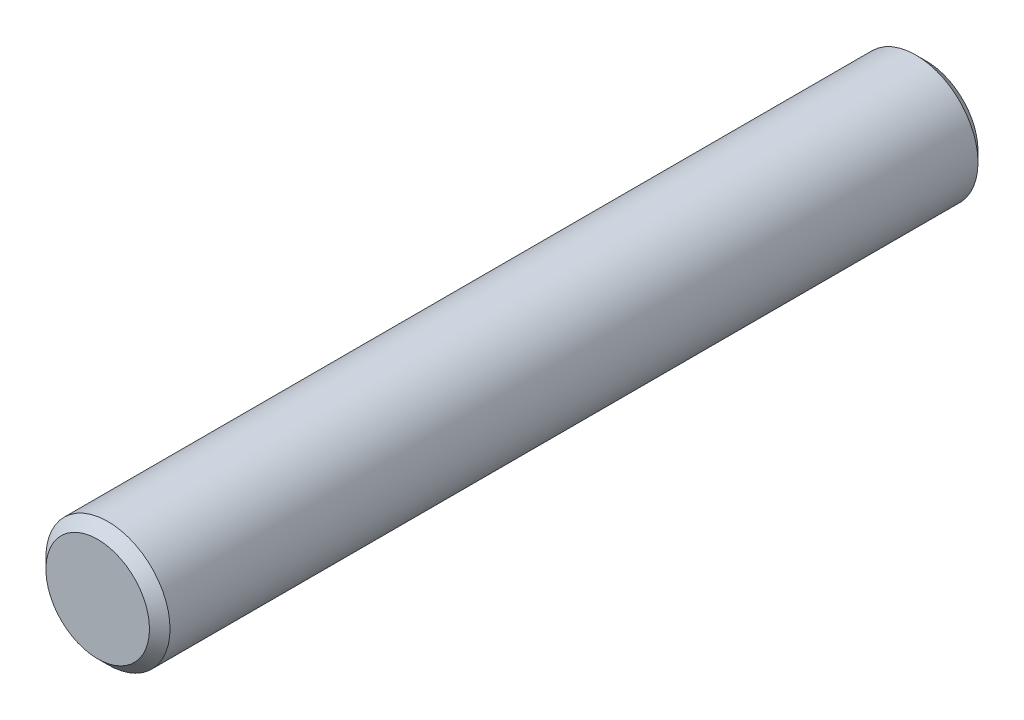
ISO-10303-21;
HEADER;
FILE_DESCRIPTION(('STEP AP214'),'2;1');
FILE_NAME('part.step','',(''),(''),'','','');
FILE_SCHEMA(('AUTOMOTIVE_DESIGN { 1 0 10303 214 1 1 1 1 }'));
ENDSEC;
DATA;
#1=APPLICATION_CONTEXT('core data for automotive mechanical design processes');
#2=APPLICATION_PROTOCOL_DEFINITION('international standard','automotive_design',2000,#1);
#3=PRODUCT_CONTEXT('',#1,'mechanical');
#4=PRODUCT('Part','Part','',(#3));
#5=PRODUCT_RELATED_PRODUCT_CATEGORY('part','',(#4));
#6=PRODUCT_DEFINITION_FORMATION('','',#4);
#7=PRODUCT_DEFINITION_CONTEXT('part definition',#1,'design');
#8=PRODUCT_DEFINITION('design','',#6,#7);
#9=PRODUCT_DEFINITION_SHAPE('','',#8);
#10=(LENGTH_UNIT() NAMED_UNIT(*) SI_UNIT(.MILLI.,.METRE.));
#11=(NAMED_UNIT(*) PLANE_ANGLE_UNIT() SI_UNIT($,.RADIAN.));
#12=(NAMED_UNIT(*) SI_UNIT($,.STERADIAN.) SOLID_ANGLE_UNIT());
#13=UNCERTAINTY_MEASURE_WITH_UNIT(LENGTH_MEASURE(1.E-05),#10,'distance_accuracy_value','');
#14=(GEOMETRIC_REPRESENTATION_CONTEXT(3) GLOBAL_UNCERTAINTY_ASSIGNED_CONTEXT((#13)) GLOBAL_UNIT_ASSIGNED_CONTEXT((#10,
#11,#12)) REPRESENTATION_CONTEXT('',''));
#15=CARTESIAN_POINT('',(0.,0.,0.));
#16=DIRECTION('',(0.,0.,1.));
#17=DIRECTION('',(1.,0.,0.));
#18=AXIS2_PLACEMENT_3D('',#15,#16,#17);
#19=CARTESIAN_POINT('',(0.,0.,2.5));
#20=DIRECTION('',(0.,0.,-1.));
#21=DIRECTION('',(-1.,0.,0.));
#22=AXIS2_PLACEMENT_3D('',#19,#20,#21);
#23=CYLINDRICAL_SURFACE('',#22,0.3745);
#24=CARTESIAN_POINT('',(0.,0.,-2.438));
#25=DIRECTION('',(0.,0.,1.));
#26=DIRECTION('',(1.,0.,0.));
#27=AXIS2_PLACEMENT_3D('',#24,#25,#26);
#28=CIRCLE('',#27,0.3745);
#29=CARTESIAN_POINT('',(0.3745,0.,-2.438));
#30=VERTEX_POINT('',#29);
#31=EDGE_CURVE('E42',#30,#30,#28,.T.);
#32=ORIENTED_EDGE('',*,*,#31,.T.);
#33=EDGE_LOOP('',(#32));
#34=FACE_BOUND('',#33,.T.);
#35=CARTESIAN_POINT('',(0.,0.,2.438));
#36=DIRECTION('',(0.,0.,1.));
#37=DIRECTION('',(1.,0.,0.));
#38=AXIS2_PLACEMENT_3D('',#35,#36,#37);
#39=CIRCLE('',#38,0.3745);
#40=CARTESIAN_POINT('',(0.3745,0.,2.438));
#41=VERTEX_POINT('',#40);
#42=EDGE_CURVE('E46',#41,#41,#39,.F.);
#43=ORIENTED_EDGE('',*,*,#42,.T.);
#44=EDGE_LOOP('',(#43));
#45=FACE_BOUND('',#44,.T.);
#46=ADVANCED_FACE('F31',(#34,#45),#23,.T.);
#47=CARTESIAN_POINT('',(0.,0.,2.5));
#48=DIRECTION('',(0.,0.,1.));
#49=DIRECTION('',(1.,0.,0.));
#50=AXIS2_PLACEMENT_3D('',#47,#48,#49);
#51=PLANE('',#50);
#52=CARTESIAN_POINT('',(0.,0.,2.5));
#53=DIRECTION('',(0.,0.,1.));
#54=DIRECTION('',(1.,0.,0.));
#55=AXIS2_PLACEMENT_3D('',#52,#53,#54);
#56=CIRCLE('',#55,0.312500000000001);
#57=CARTESIAN_POINT('',(0.312500000000001,0.,2.5));
#58=VERTEX_POINT('',#57);
#59=EDGE_CURVE('E10',#58,#58,#56,.T.);
#60=ORIENTED_EDGE('',*,*,#59,.T.);
#61=EDGE_LOOP('',(#60));
#62=FACE_BOUND('',#61,.T.);
#63=ADVANCED_FACE('F62',(#62),#51,.T.);
#64=CARTESIAN_POINT('',(0.,0.,-2.5));
#65=DIRECTION('',(0.,0.,1.));
#66=DIRECTION('',(1.,0.,0.));
#67=AXIS2_PLACEMENT_3D('',#64,#65,#66);
#68=PLANE('',#67);
#69=CARTESIAN_POINT('',(0.,0.,-2.5));
#70=DIRECTION('',(0.,0.,1.));
#71=DIRECTION('',(1.,0.,0.));
#72=AXIS2_PLACEMENT_3D('',#69,#70,#71);
#73=CIRCLE('',#72,0.3125);
#74=CARTESIAN_POINT('',(0.3125,0.,-2.5));
#75=VERTEX_POINT('',#74);
#76=EDGE_CURVE('E38',#75,#75,#73,.F.);
#77=ORIENTED_EDGE('',*,*,#76,.T.);
#78=EDGE_LOOP('',(#77));
#79=FACE_BOUND('',#78,.T.);
#80=ADVANCED_FACE('F59',(#79),#68,.F.);
#81=CARTESIAN_POINT('',(0.,0.,-2.438));
#82=DIRECTION('',(0.,0.,1.));
#83=DIRECTION('',(1.,0.,0.));
#84=AXIS2_PLACEMENT_3D('',#81,#82,#83);
#85=CONICAL_SURFACE('',#84,0.3745,0.785398163397446);
#86=ORIENTED_EDGE('',*,*,#76,.F.);
#87=EDGE_LOOP('',(#86));
#88=FACE_BOUND('',#87,.T.);
#89=ORIENTED_EDGE('',*,*,#31,.F.);
#90=EDGE_LOOP('',(#89));
#91=FACE_BOUND('',#90,.T.);
#92=ADVANCED_FACE('F55',(#88,#91),#85,.T.);
#93=CARTESIAN_POINT('',(0.,0.,2.5));
#94=DIRECTION('',(0.,0.,-1.));
#95=DIRECTION('',(-1.,0.,0.));
#96=AXIS2_PLACEMENT_3D('',#93,#94,#95);
#97=CONICAL_SURFACE('',#96,0.312500000000001,0.785398163397439);
#98=ORIENTED_EDGE('',*,*,#42,.F.);
#99=EDGE_LOOP('',(#98));
#100=FACE_BOUND('',#99,.T.);
#101=ORIENTED_EDGE('',*,*,#59,.F.);
#102=EDGE_LOOP('',(#101));
#103=FACE_BOUND('',#102,.T.);
#104=ADVANCED_FACE('F33',(#100,#103),#97,.T.);
#105=CLOSED_SHELL('',(#46,#63,#80,#92,#104));
#106=MANIFOLD_SOLID_BREP('B2',#105);
#107=ADVANCED_BREP_SHAPE_REPRESENTATION('',(#18,#106),#14);
#108=SHAPE_DEFINITION_REPRESENTATION(#9,#107);
ENDSEC;
END-ISO-10303-21;
